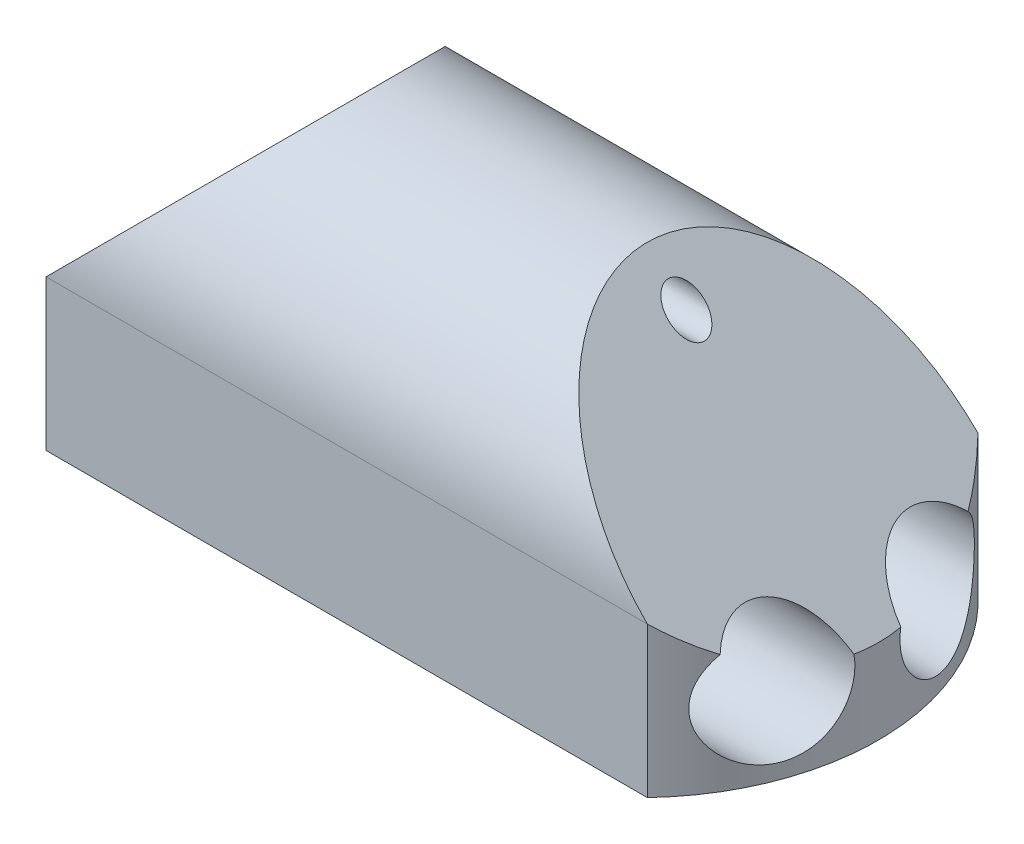
ISO-10303-21;
HEADER;
FILE_DESCRIPTION(('STEP AP214'),'2;1');
FILE_NAME('part.step','',(''),(''),'','','');
FILE_SCHEMA(('AUTOMOTIVE_DESIGN { 1 0 10303 214 1 1 1 1 }'));
ENDSEC;
DATA;
#1=APPLICATION_CONTEXT('core data for automotive mechanical design processes');
#2=APPLICATION_PROTOCOL_DEFINITION('international standard','automotive_design',2000,#1);
#3=PRODUCT_CONTEXT('',#1,'mechanical');
#4=PRODUCT('Part','Part','',(#3));
#5=PRODUCT_RELATED_PRODUCT_CATEGORY('part','',(#4));
#6=PRODUCT_DEFINITION_FORMATION('','',#4);
#7=PRODUCT_DEFINITION_CONTEXT('part definition',#1,'design');
#8=PRODUCT_DEFINITION('design','',#6,#7);
#9=PRODUCT_DEFINITION_SHAPE('','',#8);
#10=(LENGTH_UNIT() NAMED_UNIT(*) SI_UNIT(.MILLI.,.METRE.));
#11=(NAMED_UNIT(*) PLANE_ANGLE_UNIT() SI_UNIT($,.RADIAN.));
#12=(NAMED_UNIT(*) SI_UNIT($,.STERADIAN.) SOLID_ANGLE_UNIT());
#13=UNCERTAINTY_MEASURE_WITH_UNIT(LENGTH_MEASURE(1.E-05),#10,'distance_accuracy_value','');
#14=(GEOMETRIC_REPRESENTATION_CONTEXT(3) GLOBAL_UNCERTAINTY_ASSIGNED_CONTEXT((#13)) GLOBAL_UNIT_ASSIGNED_CONTEXT((#10,
#11,#12)) REPRESENTATION_CONTEXT('',''));
#15=CARTESIAN_POINT('',(0.,0.,0.));
#16=DIRECTION('',(0.,0.,1.));
#17=DIRECTION('',(1.,0.,0.));
#18=AXIS2_PLACEMENT_3D('',#15,#16,#17);
#19=CARTESIAN_POINT('',(0.,0.,0.));
#20=DIRECTION('',(0.,1.,0.));
#21=DIRECTION('',(0.,0.,1.));
#22=AXIS2_PLACEMENT_3D('',#19,#20,#21);
#23=PLANE('',#22);
#24=CARTESIAN_POINT('',(-32.7780332745251,0.,-6.985));
#25=DIRECTION('',(0.,1.,0.));
#26=DIRECTION('',(0.,0.,-1.));
#27=AXIS2_PLACEMENT_3D('',#24,#25,#26);
#28=CIRCLE('',#27,10.16);
#29=CARTESIAN_POINT('',(-25.4,0.,0.));
#30=VERTEX_POINT('',#29);
#31=CARTESIAN_POINT('',(-25.4,0.,-13.97));
#32=VERTEX_POINT('',#31);
#33=EDGE_CURVE('E95',#30,#32,#28,.T.);
#34=ORIENTED_EDGE('',*,*,#33,.T.);
#35=DIRECTION('',(-1.,0.,0.));
#36=VECTOR('',#35,1.);
#37=CARTESIAN_POINT('',(0.,0.,-13.97));
#38=LINE('',#37,#36);
#39=CARTESIAN_POINT('',(0.,0.,-13.97));
#40=VERTEX_POINT('',#39);
#41=EDGE_CURVE('E110',#40,#32,#38,.T.);
#42=ORIENTED_EDGE('',*,*,#41,.F.);
#43=CARTESIAN_POINT('',(-7.37803327452513,0.,-6.985));
#44=DIRECTION('',(0.,1.,0.));
#45=DIRECTION('',(0.,0.,-1.));
#46=AXIS2_PLACEMENT_3D('',#43,#44,#45);
#47=CIRCLE('',#46,10.16);
#48=CARTESIAN_POINT('',(0.,0.,0.));
#49=VERTEX_POINT('',#48);
#50=EDGE_CURVE('E199',#49,#40,#47,.T.);
#51=ORIENTED_EDGE('',*,*,#50,.F.);
#52=DIRECTION('',(1.,0.,0.));
#53=VECTOR('',#52,1.);
#54=CARTESIAN_POINT('',(0.,0.,0.));
#55=LINE('',#54,#53);
#56=EDGE_CURVE('E112',#30,#49,#55,.T.);
#57=ORIENTED_EDGE('',*,*,#56,.F.);
#58=EDGE_LOOP('',(#34,#42,#51,#57));
#59=FACE_BOUND('',#58,.T.);
#60=ADVANCED_FACE('F35',(#59),#23,.F.);
#61=CARTESIAN_POINT('',(-18.4150000000001,13.335,-13.97));
#62=DIRECTION('',(0.707106781186551,-0.707106781186544,0.));
#63=DIRECTION('',(0.707106781186544,0.707106781186551,0.));
#64=AXIS2_PLACEMENT_3D('',#61,#62,#63);
#65=PLANE('',#64);
#66=CARTESIAN_POINT('',(-20.0660000000001,11.684,-6.985));
#67=DIRECTION('',(0.707106781186551,-0.707106781186544,0.));
#68=DIRECTION('',(0.707106781186544,0.707106781186551,0.));
#69=AXIS2_PLACEMENT_3D('',#66,#67,#68);
#70=ELLIPSE('',#69,1.07763073452829,0.761999999999999);
#71=CARTESIAN_POINT('',(-19.3040000000001,12.446,-6.985));
#72=VERTEX_POINT('',#71);
#73=EDGE_CURVE('E116',#72,#72,#70,.T.);
#74=ORIENTED_EDGE('',*,*,#73,.T.);
#75=EDGE_LOOP('',(#74));
#76=FACE_BOUND('',#75,.T.);
#77=CARTESIAN_POINT('',(-32.7780332745251,-1.02803327452521,-6.985));
#78=DIRECTION('',(0.707106781186551,-0.707106781186544,0.));
#79=DIRECTION('',(-0.707106781186544,-0.707106781186551,0.));
#80=AXIS2_PLACEMENT_3D('',#77,#78,#79);
#81=ELLIPSE('',#80,14.3684097937107,10.16);
#82=CARTESIAN_POINT('',(-25.4,6.35,0.));
#83=VERTEX_POINT('',#82);
#84=CARTESIAN_POINT('',(-25.4,6.34999999999999,-13.97));
#85=VERTEX_POINT('',#84);
#86=EDGE_CURVE('E98',#83,#85,#81,.F.);
#87=ORIENTED_EDGE('',*,*,#86,.F.);
#88=CARTESIAN_POINT('',(-25.4,6.35,-6.985));
#89=DIRECTION('',(0.707106781186551,-0.707106781186544,0.));
#90=DIRECTION('',(0.707106781186544,0.707106781186551,0.));
#91=AXIS2_PLACEMENT_3D('',#88,#89,#90);
#92=ELLIPSE('',#91,9.87828173317602,6.985);
#93=EDGE_CURVE('E132',#83,#85,#92,.F.);
#94=ORIENTED_EDGE('',*,*,#93,.T.);
#95=EDGE_LOOP('',(#87,#94));
#96=FACE_BOUND('',#95,.T.);
#97=ADVANCED_FACE('F171',(#76,#96),#65,.F.);
#98=CARTESIAN_POINT('',(-25.4,3.175,-10.4775));
#99=DIRECTION('',(1.,0.,0.));
#100=DIRECTION('',(0.,0.,-1.));
#101=AXIS2_PLACEMENT_3D('',#98,#99,#100);
#102=CYLINDRICAL_SURFACE('',#101,2.54);
#103=CARTESIAN_POINT('',(2.73721974999186,3.175,-7.9375));
#104=CARTESIAN_POINT('',(2.73721906027399,3.31695056010636,-7.93749809184022));
#105=CARTESIAN_POINT('',(2.7361177638684,3.45888281351642,-7.94942622657704));
#106=CARTESIAN_POINT('',(2.73148988664729,3.73870929600429,-7.99678273971192));
#107=CARTESIAN_POINT('',(2.72796384850385,3.87660442141807,-8.03220585972523));
#108=CARTESIAN_POINT('',(2.71785686136224,4.14449569136922,-8.12552153858456));
#109=CARTESIAN_POINT('',(2.71127506852978,4.27448964280844,-8.18342030326473));
#110=CARTESIAN_POINT('',(2.69411872174891,4.52281674788083,-8.31994051210836));
#111=CARTESIAN_POINT('',(2.68354417037861,4.64114990904327,-8.39856194289127));
#112=CARTESIAN_POINT('',(2.65737021025236,4.86233039821777,-8.57373015225616));
#113=CARTESIAN_POINT('',(2.64179023884371,4.96523540687207,-8.67020698910633));
#114=CARTESIAN_POINT('',(2.60458390497793,5.15322646670759,-8.87816783220989));
#115=CARTESIAN_POINT('',(2.58295815684411,5.23831432678884,-8.98965031311366));
#116=CARTESIAN_POINT('',(2.53303875766416,5.38814731172166,-9.22340215352028));
#117=CARTESIAN_POINT('',(2.50477732509994,5.45298730963365,-9.34561766003924));
#118=CARTESIAN_POINT('',(2.44123667040064,5.56157396499359,-9.59735149592417));
#119=CARTESIAN_POINT('',(2.40595716539039,5.60531977196134,-9.7268701195037));
#120=CARTESIAN_POINT('',(2.32790633294339,5.67189306645257,-9.99161075018914));
#121=CARTESIAN_POINT('',(2.28501297540674,5.69433487496833,-10.1268932151274));
#122=CARTESIAN_POINT('',(2.1929246559385,5.71735222611859,-10.3971500560066));
#123=CARTESIAN_POINT('',(2.14372802851654,5.71792197757359,-10.5321243408898));
#124=CARTESIAN_POINT('',(2.03703230003428,5.6975663986833,-10.8066654636064));
#125=CARTESIAN_POINT('',(1.97920925295769,5.67532251127417,-10.9460073162003));
#126=CARTESIAN_POINT('',(1.85957299107775,5.60882845300609,-11.21752662161));
#127=CARTESIAN_POINT('',(1.79775835276084,5.56457039313602,-11.3497014872154));
#128=CARTESIAN_POINT('',(1.66674155569754,5.45079865577947,-11.6154921570743));
#129=CARTESIAN_POINT('',(1.59736588896667,5.37941584672289,-11.7482244113817));
#130=CARTESIAN_POINT('',(1.45944542936374,5.21406415592915,-11.9994942479038));
#131=CARTESIAN_POINT('',(1.39090152890937,5.12007294089013,-12.1180176195701));
#132=CARTESIAN_POINT('',(1.25567521202204,4.90660530194709,-12.3424749303166));
#133=CARTESIAN_POINT('',(1.18918905371905,4.78623088142613,-12.4476794405121));
#134=CARTESIAN_POINT('',(1.06656133771189,4.52440743159231,-12.6353977355142));
#135=CARTESIAN_POINT('',(1.01039967044568,4.38300036232294,-12.717955787851));
#136=CARTESIAN_POINT('',(0.928046966015525,4.12452450197372,-12.8363507331254));
#137=CARTESIAN_POINT('',(0.89786755227368,4.01173926567244,-12.8787971019484));
#138=CARTESIAN_POINT('',(0.848444513409539,3.77909173627619,-12.9475893644231));
#139=CARTESIAN_POINT('',(0.829189476977787,3.65923697287831,-12.9739520608218));
#140=CARTESIAN_POINT('',(0.803390037630915,3.41503168480746,-13.009152467513));
#141=CARTESIAN_POINT('',(0.796903631030834,3.29066324803801,-13.0179102182822));
#142=CARTESIAN_POINT('',(0.797530963032158,3.04201466989851,-13.0170602486967));
#143=CARTESIAN_POINT('',(0.8046448211437,2.91773452931393,-13.007452366957));
#144=CARTESIAN_POINT('',(0.830732572510217,2.68192396582766,-12.9718345496826));
#145=CARTESIAN_POINT('',(0.84884072020756,2.57011028353011,-12.9470207824147));
#146=CARTESIAN_POINT('',(0.894600013099327,2.35263673297545,-12.8833611438528));
#147=CARTESIAN_POINT('',(0.922253752927593,2.24697854700956,-12.8445114572531));
#148=CARTESIAN_POINT('',(0.987695258382301,2.03551147427037,-12.7507344336018));
#149=CARTESIAN_POINT('',(1.02611479936958,1.93036100598287,-12.694772911681));
#150=CARTESIAN_POINT('',(1.10941143668679,1.73067953870902,-12.5702035461584));
#151=CARTESIAN_POINT('',(1.15429189436589,1.63615411336586,-12.501589114515));
#152=CARTESIAN_POINT('',(1.25665128041502,1.44284156374011,-12.3402281284955));
#153=CARTESIAN_POINT('',(1.31495424654182,1.34626001087146,-12.2453598020459));
#154=CARTESIAN_POINT('',(1.43445809697138,1.16998498144274,-12.0426152310849));
#155=CARTESIAN_POINT('',(1.49566102521998,1.09030363975982,-11.934729726452));
#156=CARTESIAN_POINT('',(1.62717029683438,0.938826493308004,-11.6917569750087));
#157=CARTESIAN_POINT('',(1.69753331379615,0.86976418247584,-11.5549832839876));
#158=CARTESIAN_POINT('',(1.83550550464592,0.756942471523878,-11.2700167081104));
#159=CARTESIAN_POINT('',(1.90311404247494,0.713188885205304,-11.121821208343));
#160=CARTESIAN_POINT('',(2.03381445550775,0.652643520262339,-10.8152573893652));
#161=CARTESIAN_POINT('',(2.09682223098564,0.636270921474232,-10.656768832437));
#162=CARTESIAN_POINT('',(2.21475600584456,0.633873764258213,-10.3365724228354));
#163=CARTESIAN_POINT('',(2.26968694974814,0.647830555323477,-10.1748666091462));
#164=CARTESIAN_POINT('',(2.36580205827442,0.704855325686302,-9.86721285573255));
#165=CARTESIAN_POINT('',(2.40773845289998,0.745479263818787,-9.72104764309525));
#166=CARTESIAN_POINT('',(2.48288855469151,0.853175501014853,-9.43642113537756));
#167=CARTESIAN_POINT('',(2.51610642859401,0.920235127510896,-9.29795618523277));
#168=CARTESIAN_POINT('',(2.57185942217286,1.07313128416887,-9.04432875784174));
#169=CARTESIAN_POINT('',(2.59501846064525,1.15713328451185,-8.92819356657036));
#170=CARTESIAN_POINT('',(2.6348725232538,1.34414496075781,-8.7111253783054));
#171=CARTESIAN_POINT('',(2.6515688306576,1.44715085716115,-8.61018936573205));
#172=CARTESIAN_POINT('',(2.67918595743262,1.66626043347009,-8.42934036755286));
#173=CARTESIAN_POINT('',(2.690247091357,1.78194851492975,-8.34894439581169));
#174=CARTESIAN_POINT('',(2.70830903569951,2.02527292658786,-8.20825192444117));
#175=CARTESIAN_POINT('',(2.71530889795265,2.15291203886289,-8.14796011982838));
#176=CARTESIAN_POINT('',(2.72660741929951,2.42662602776476,-8.04552974864473));
#177=CARTESIAN_POINT('',(2.73065900664141,2.57336441692772,-8.0051288630493));
#178=CARTESIAN_POINT('',(2.73596559098812,2.87174204759842,-7.95111452259225));
#179=CARTESIAN_POINT('',(2.73722048668505,3.02338146644012,-7.9375020381208));
#180=CARTESIAN_POINT('',(2.73721974999186,3.175,-7.9375));
#181=B_SPLINE_CURVE_WITH_KNOTS('',3,(#103,#104,#105,#106,#107,#108,#109,#110,#111,#112,#113,
#114,#115,#116,#117,#118,#119,#120,#121,#122,#123,#124,#125,#126,#127,#128,#129,#130,#131,#132,
#133,#134,#135,#136,#137,#138,#139,#140,#141,#142,#143,#144,#145,#146,#147,#148,#149,#150,#151,
#152,#153,#154,#155,#156,#157,#158,#159,#160,#161,#162,#163,#164,#165,#166,#167,#168,#169,#170,
#171,#172,#173,#174,#175,#176,#177,#178,#179,#180),.UNSPECIFIED.,.T.,.F.,(4,2,2,2,2,2,2,2,2,2,2,
2,2,2,2,2,2,2,2,2,2,2,2,2,2,2,2,2,2,2,2,2,2,2,2,2,2,2,4),(0.,0.425318588981189,
0.850542020020345,1.27588294469666,1.70122359473223,2.12493210565385,2.54859757835587,
2.97024706435505,3.39191354908911,3.82107580036381,4.2503516823998,4.705917643569,
5.16164697935762,5.65720360692176,6.15325178610116,6.6699487514686,7.18562840161105,
7.55680538329195,7.92759392628081,8.30006277487051,8.67253489648527,9.01891411829597,
9.3653875653644,9.73945997637023,10.1137277099476,10.5542216683639,10.9950308523272,
11.4985367658284,12.0021582964548,12.5134215503766,13.0243705012261,13.4940227505119,
13.9634501342138,14.3968750719173,14.8302139027,15.2521587637378,15.6742020945561,
16.12847184081,16.5827580423493),.UNSPECIFIED.);
#182=CARTESIAN_POINT('',(1.32848033710142,5.02151966289856,-12.221623027349));
#183=VERTEX_POINT('',#182);
#184=CARTESIAN_POINT('',(2.73350438603333,3.61649561396664,-7.97616403239225));
#185=VERTEX_POINT('',#184);
#186=EDGE_CURVE('E49',#183,#185,#181,.T.);
#187=ORIENTED_EDGE('',*,*,#186,.F.);
#188=CARTESIAN_POINT('',(3.17499999999997,3.175,-10.4775));
#189=DIRECTION('',(-0.707106781186551,-0.707106781186544,0.));
#190=DIRECTION('',(-0.707106781186544,0.707106781186551,0.));
#191=AXIS2_PLACEMENT_3D('',#188,#189,#190);
#192=ELLIPSE('',#191,3.59210244842764,2.54);
#193=EDGE_CURVE('E61',#185,#183,#192,.T.);
#194=ORIENTED_EDGE('',*,*,#193,.F.);
#195=EDGE_LOOP('',(#187,#194));
#196=FACE_BOUND('',#195,.T.);
#197=CARTESIAN_POINT('',(-24.6027935991395,3.175,-13.0175));
#198=CARTESIAN_POINT('',(-24.6027966772723,3.30018653832455,-13.0175030201078));
#199=CARTESIAN_POINT('',(-24.595900607442,3.42535661642611,-13.0081915560159));
#200=CARTESIAN_POINT('',(-24.5690863608112,3.67160149412925,-12.9715923788197));
#201=CARTESIAN_POINT('',(-24.5491626115201,3.79267451792812,-12.9442969731832));
#202=CARTESIAN_POINT('',(-24.4983891994344,4.02673881055394,-12.8735442429834));
#203=CARTESIAN_POINT('',(-24.4675989255979,4.13977007361573,-12.8301747051808));
#204=CARTESIAN_POINT('',(-24.3974995915055,4.35638522763789,-12.7292163983443));
#205=CARTESIAN_POINT('',(-24.3581876792693,4.45996593920316,-12.6716228679925));
#206=CARTESIAN_POINT('',(-24.2694371171888,4.66568853781863,-12.5380527919097));
#207=CARTESIAN_POINT('',(-24.2193927346041,4.7667708455449,-12.4608538726252));
#208=CARTESIAN_POINT('',(-24.1147431082981,4.95509408554005,-12.2937417512434));
#209=CARTESIAN_POINT('',(-24.0601355044007,5.04232778658788,-12.2038219528204));
#210=CARTESIAN_POINT('',(-23.9388217290378,5.2163243400535,-11.9960697280365));
#211=CARTESIAN_POINT('',(-23.8716860599448,5.30026593846721,-11.8761144870311));
#212=CARTESIAN_POINT('',(-23.7375503998917,5.44647153508358,-11.6235072149545));
#213=CARTESIAN_POINT('',(-23.6705505151299,5.50872243387198,-11.4908475728923));
#214=CARTESIAN_POINT('',(-23.5346539370555,5.61352781846064,-11.2054561336206));
#215=CARTESIAN_POINT('',(-23.4659735830159,5.65432090870956,-11.0519662231193));
#216=CARTESIAN_POINT('',(-23.3348618989513,5.70667728528842,-10.7374779802356));
#217=CARTESIAN_POINT('',(-23.2724284004546,5.71825074867378,-10.5764822819863));
#218=CARTESIAN_POINT('',(-23.1591422418123,5.71038637829767,-10.2605501842041));
#219=CARTESIAN_POINT('',(-23.1078568872538,5.69252580716083,-10.1057325919467));
#220=CARTESIAN_POINT('',(-23.0143248199334,5.62781684150893,-9.79946075021638));
#221=CARTESIAN_POINT('',(-22.9720723918642,5.58098684998462,-9.64800442870025));
#222=CARTESIAN_POINT('',(-22.9003960365494,5.46427664532614,-9.36764065410984));
#223=CARTESIAN_POINT('',(-22.870164509262,5.39682206794475,-9.2379264920676));
#224=CARTESIAN_POINT('',(-22.8172293018164,5.23976025939415,-8.9909752041241));
#225=CARTESIAN_POINT('',(-22.7945236195898,5.15015893092111,-8.87373476553573));
#226=CARTESIAN_POINT('',(-22.7566974939606,4.95609336683187,-8.66117513604803));
#227=CARTESIAN_POINT('',(-22.7412678009352,4.85253805967186,-8.56507885118109));
#228=CARTESIAN_POINT('',(-22.715423928938,4.63054157361901,-8.39114483451089));
#229=CARTESIAN_POINT('',(-22.7050095056098,4.51210112032186,-8.31330621324403));
#230=CARTESIAN_POINT('',(-22.6881668833979,4.26434392655092,-8.1786494347927));
#231=CARTESIAN_POINT('',(-22.6817190002024,4.13508457062314,-8.1217280506002));
#232=CARTESIAN_POINT('',(-22.6718163639892,3.8688232576085,-8.03004502411427));
#233=CARTESIAN_POINT('',(-22.6683617020157,3.73182106514443,-7.99528405587801));
#234=CARTESIAN_POINT('',(-22.6638216177866,3.45302526869234,-7.94878465300329));
#235=CARTESIAN_POINT('',(-22.6627514485585,3.3112066763051,-7.93719448456014));
#236=CARTESIAN_POINT('',(-22.6628102079115,3.02761995838669,-7.937817803255));
#237=CARTESIAN_POINT('',(-22.6639391913154,2.88585183420175,-7.95003188381141));
#238=CARTESIAN_POINT('',(-22.6686289005705,2.60600059542763,-7.99797471874004));
#239=CARTESIAN_POINT('',(-22.6721960518284,2.46792822196339,-8.03376559698812));
#240=CARTESIAN_POINT('',(-22.6824065684849,2.19980167345853,-8.12786739272736));
#241=CARTESIAN_POINT('',(-22.689049902893,2.06974741765534,-8.1861780833445));
#242=CARTESIAN_POINT('',(-22.7063375871229,1.8216839706007,-8.32339274744581));
#243=CARTESIAN_POINT('',(-22.7169725634684,1.70364737771994,-8.40224834416381));
#244=CARTESIAN_POINT('',(-22.7433252401187,1.48266556997117,-8.57814674015882));
#245=CARTESIAN_POINT('',(-22.7590424886944,1.37971901503184,-8.6751879227183));
#246=CARTESIAN_POINT('',(-22.7964555484149,1.19239909324887,-8.88363639854859));
#247=CARTESIAN_POINT('',(-22.8181119987727,1.10790980721655,-8.99494662639658));
#248=CARTESIAN_POINT('',(-22.8681719493131,0.958807206228872,-9.22877402911151));
#249=CARTESIAN_POINT('',(-22.8965750958988,0.894192850027464,-9.3512906164417));
#250=CARTESIAN_POINT('',(-22.9605174487768,0.785963198910119,-9.60396998269557));
#251=CARTESIAN_POINT('',(-22.9960783222532,0.742413063624974,-9.73415510763248));
#252=CARTESIAN_POINT('',(-23.074053668157,0.676999300529446,-9.99785447069326));
#253=CARTESIAN_POINT('',(-23.1164692506968,0.655139189495106,-10.1313692450833));
#254=CARTESIAN_POINT('',(-23.2092032441223,0.632280748698048,-10.4032612843401));
#255=CARTESIAN_POINT('',(-23.2597650656615,0.632127875950935,-10.5416254546965));
#256=CARTESIAN_POINT('',(-23.3662335790107,0.653734088478592,-10.8145054102903));
#257=CARTESIAN_POINT('',(-23.4221418405564,0.675499627071429,-10.9490200501362));
#258=CARTESIAN_POINT('',(-23.5423153611568,0.742145033586789,-11.2218696058777));
#259=CARTESIAN_POINT('',(-23.6068913813567,0.788734272845651,-11.3596496788879));
#260=CARTESIAN_POINT('',(-23.7380387515858,0.904174598796409,-11.6246118270681));
#261=CARTESIAN_POINT('',(-23.8046116304094,0.973043158733937,-11.751785485037));
#262=CARTESIAN_POINT('',(-23.9420575341042,1.13764379685554,-12.0022767886119));
#263=CARTESIAN_POINT('',(-24.0128669342844,1.23503611345806,-12.1245434088621));
#264=CARTESIAN_POINT('',(-24.1493879606964,1.45230115504296,-12.3505846801099));
#265=CARTESIAN_POINT('',(-24.2151031008353,1.57215818576942,-12.454372142868));
#266=CARTESIAN_POINT('',(-24.3241835860862,1.80649195206969,-12.6211252962483));
#267=CARTESIAN_POINT('',(-24.3693908001693,1.9172560504611,-12.6881039319954));
#268=CARTESIAN_POINT('',(-24.4501445825427,2.15053709429673,-12.8053905256951));
#269=CARTESIAN_POINT('',(-24.4857004028499,2.2730426306055,-12.8557144593948));
#270=CARTESIAN_POINT('',(-24.5430382321084,2.52329069369004,-12.9358688692223));
#271=CARTESIAN_POINT('',(-24.5652168481099,2.65074892697718,-12.966291969961));
#272=CARTESIAN_POINT('',(-24.5950873450962,2.91048008082097,-13.0070982478488));
#273=CARTESIAN_POINT('',(-24.6027903473086,3.04274922557429,-13.0174968094685));
#274=CARTESIAN_POINT('',(-24.6027935991395,3.175,-13.0175));
#275=B_SPLINE_CURVE_WITH_KNOTS('',3,(#197,#198,#199,#200,#201,#202,#203,#204,#205,#206,#207,
#208,#209,#210,#211,#212,#213,#214,#215,#216,#217,#218,#219,#220,#221,#222,#223,#224,#225,#226,
#227,#228,#229,#230,#231,#232,#233,#234,#235,#236,#237,#238,#239,#240,#241,#242,#243,#244,#245,
#246,#247,#248,#249,#250,#251,#252,#253,#254,#255,#256,#257,#258,#259,#260,#261,#262,#263,#264,
#265,#266,#267,#268,#269,#270,#271,#272,#273,#274),.UNSPECIFIED.,.T.,.F.,(4,2,2,2,2,2,2,2,2,2,2,
2,2,2,2,2,2,2,2,2,2,2,2,2,2,2,2,2,2,2,2,2,2,2,2,2,2,2,4),(0.,0.37502119018989,0.750202897868295,
1.12336508858388,1.49665236075328,1.90519056026372,2.31394138632751,2.7951058664277,
3.27656042904469,3.79302431260913,4.30930828945736,4.79881530067425,5.28801166862788,
5.73361929078032,6.17910827451592,6.60342171805122,7.02771448589668,7.44988430892716,
7.87206697255697,8.29694257698478,8.72182877331251,9.1478390294207,9.57384499383516,
9.99885677480127,10.4238307896863,10.8460537413329,11.2682545689824,11.691753201418,
12.1153204878381,12.5553805880568,12.9955702906579,13.4709645065695,13.9467324726674,
14.4591365974195,14.9711840727398,15.3808892682627,15.7902003140137,16.1866885654344,
16.5828720807903),.UNSPECIFIED.);
#276=CARTESIAN_POINT('',(-24.6027935991395,3.175,-13.0175));
#277=VERTEX_POINT('',#276);
#278=EDGE_CURVE('E158',#277,#277,#275,.T.);
#279=ORIENTED_EDGE('',*,*,#278,.F.);
#280=EDGE_LOOP('',(#279));
#281=FACE_BOUND('',#280,.T.);
#282=ADVANCED_FACE('F166',(#196,#281),#102,.F.);
#283=CARTESIAN_POINT('',(-25.4,3.175,-3.4925));
#284=DIRECTION('',(1.,0.,0.));
#285=DIRECTION('',(0.,0.,-1.));
#286=AXIS2_PLACEMENT_3D('',#283,#284,#285);
#287=CYLINDRICAL_SURFACE('',#286,2.54);
#288=CARTESIAN_POINT('',(0.797206400860541,3.175,-0.9525));
#289=CARTESIAN_POINT('',(0.797203322727675,3.30018653832455,-0.952496979892189));
#290=CARTESIAN_POINT('',(0.804099392558012,3.42535661642611,-0.961808443984064));
#291=CARTESIAN_POINT('',(0.830913639188777,3.67160149412925,-0.998407621180264));
#292=CARTESIAN_POINT('',(0.850837388479949,3.79267451792812,-1.02570302681684));
#293=CARTESIAN_POINT('',(0.901610800565639,4.02673881055394,-1.09645575701659));
#294=CARTESIAN_POINT('',(0.932401074402147,4.13977007361573,-1.13982529481918));
#295=CARTESIAN_POINT('',(1.00250040849447,4.35638522763789,-1.24078360165574));
#296=CARTESIAN_POINT('',(1.04181232073071,4.45996593920316,-1.29837713200753));
#297=CARTESIAN_POINT('',(1.13056288281124,4.66568853781863,-1.43194720809033));
#298=CARTESIAN_POINT('',(1.18060726539591,4.7667708455449,-1.50914612737485));
#299=CARTESIAN_POINT('',(1.28525689170187,4.95509408554005,-1.67625824875661));
#300=CARTESIAN_POINT('',(1.33986449559934,5.04232778658789,-1.76617804717964));
#301=CARTESIAN_POINT('',(1.46117827096218,5.2163243400535,-1.97393027196351));
#302=CARTESIAN_POINT('',(1.52831394005521,5.30026593846721,-2.09388551296892));
#303=CARTESIAN_POINT('',(1.66244960010827,5.44647153508358,-2.34649278504546));
#304=CARTESIAN_POINT('',(1.72944948487012,5.50872243387198,-2.47915242710772));
#305=CARTESIAN_POINT('',(1.86534606294454,5.61352781846064,-2.76454386637938));
#306=CARTESIAN_POINT('',(1.93402641698407,5.65432090870956,-2.91803377688069));
#307=CARTESIAN_POINT('',(2.06513810104875,5.70667728528842,-3.23252201976444));
#308=CARTESIAN_POINT('',(2.12757159954547,5.71825074867378,-3.39351771801375));
#309=CARTESIAN_POINT('',(2.24085775818774,5.71038637829767,-3.70944981579589));
#310=CARTESIAN_POINT('',(2.29214311274623,5.69252580716083,-3.86426740805335));
#311=CARTESIAN_POINT('',(2.38567518006661,5.62781684150893,-4.17053924978363));
#312=CARTESIAN_POINT('',(2.42792760813586,5.58098684998462,-4.32199557129976));
#313=CARTESIAN_POINT('',(2.49960396345063,5.46427664532614,-4.60235934589017));
#314=CARTESIAN_POINT('',(2.52983549073803,5.39682206794475,-4.73207350793241));
#315=CARTESIAN_POINT('',(2.5827706981836,5.23976025939415,-4.9790247958759));
#316=CARTESIAN_POINT('',(2.60547638041024,5.15015893092111,-5.09626523446428));
#317=CARTESIAN_POINT('',(2.64330250603939,4.95609336683187,-5.30882486395198));
#318=CARTESIAN_POINT('',(2.6587321990648,4.85253805967186,-5.40492114881892));
#319=CARTESIAN_POINT('',(2.68457607106205,4.63054157361902,-5.57885516548912));
#320=CARTESIAN_POINT('',(2.6949904943902,4.51210112032186,-5.65669378675598));
#321=CARTESIAN_POINT('',(2.71183311660211,4.26434392655092,-5.79135056520731));
#322=CARTESIAN_POINT('',(2.71828099979761,4.13508457062314,-5.84827194939981));
#323=CARTESIAN_POINT('',(2.72818363601078,3.8688232576085,-5.93995497588574));
#324=CARTESIAN_POINT('',(2.73163829798427,3.73182106514443,-5.974715944122));
#325=CARTESIAN_POINT('',(2.73617838221343,3.45302526869234,-6.02121534699671));
#326=CARTESIAN_POINT('',(2.73724855144149,3.3112066763051,-6.03280551543987));
#327=CARTESIAN_POINT('',(2.73718979208853,3.02761995838669,-6.032182196745));
#328=CARTESIAN_POINT('',(2.73606080868463,2.88585183420175,-6.01996811618859));
#329=CARTESIAN_POINT('',(2.73137109942947,2.60600059542763,-5.97202528125997));
#330=CARTESIAN_POINT('',(2.72780394817164,2.46792822196339,-5.93623440301189));
#331=CARTESIAN_POINT('',(2.71759343151512,2.19980167345853,-5.84213260727265));
#332=CARTESIAN_POINT('',(2.71095009710704,2.06974741765534,-5.78382191665551));
#333=CARTESIAN_POINT('',(2.69366241287708,1.8216839706007,-5.64660725255419));
#334=CARTESIAN_POINT('',(2.68302743653165,1.70364737771994,-5.56775165583619));
#335=CARTESIAN_POINT('',(2.65667475988127,1.48266556997117,-5.39185325984119));
#336=CARTESIAN_POINT('',(2.64095751130558,1.37971901503184,-5.2948120772817));
#337=CARTESIAN_POINT('',(2.60354445158511,1.19239909324887,-5.08636360145142));
#338=CARTESIAN_POINT('',(2.58188800122736,1.10790980721655,-4.97505337360343));
#339=CARTESIAN_POINT('',(2.53182805068687,0.958807206228872,-4.7412259708885));
#340=CARTESIAN_POINT('',(2.50342490410125,0.894192850027463,-4.6187093835583));
#341=CARTESIAN_POINT('',(2.43948255122319,0.785963198910118,-4.36603001730444));
#342=CARTESIAN_POINT('',(2.40392167774679,0.742413063624973,-4.23584489236753));
#343=CARTESIAN_POINT('',(2.325946331843,0.676999300529445,-3.97214552930674));
#344=CARTESIAN_POINT('',(2.28353074930317,0.655139189495105,-3.83863075491673));
#345=CARTESIAN_POINT('',(2.19079675587769,0.632280748698047,-3.56673871565987));
#346=CARTESIAN_POINT('',(2.14023493433853,0.632127875950934,-3.42837454530352));
#347=CARTESIAN_POINT('',(2.03376642098927,0.653734088478591,-3.15549458970967));
#348=CARTESIAN_POINT('',(1.97785815944357,0.675499627071428,-3.02097994986377));
#349=CARTESIAN_POINT('',(1.85768463884323,0.742145033586787,-2.74813039412227));
#350=CARTESIAN_POINT('',(1.79310861864335,0.788734272845649,-2.61035032111214));
#351=CARTESIAN_POINT('',(1.66196124841421,0.904174598796408,-2.34538817293188));
#352=CARTESIAN_POINT('',(1.59538836959064,0.973043158733936,-2.21821451496298));
#353=CARTESIAN_POINT('',(1.45794246589582,1.13764379685554,-1.96772321138815));
#354=CARTESIAN_POINT('',(1.38713306571564,1.23503611345805,-1.84545659113795));
#355=CARTESIAN_POINT('',(1.25061203930364,1.45230115504296,-1.61941531989013));
#356=CARTESIAN_POINT('',(1.18489689916468,1.57215818576942,-1.51562785713196));
#357=CARTESIAN_POINT('',(1.07581641391381,1.80649195206968,-1.34887470375167));
#358=CARTESIAN_POINT('',(1.03060919983067,1.9172560504611,-1.28189606800462));
#359=CARTESIAN_POINT('',(0.949855417457354,2.15053709429672,-1.16460947430489));
#360=CARTESIAN_POINT('',(0.914299597150164,2.2730426306055,-1.11428554060518));
#361=CARTESIAN_POINT('',(0.856961767891578,2.52329069369004,-1.03413113077774));
#362=CARTESIAN_POINT('',(0.834783151890134,2.65074892697718,-1.00370803003896));
#363=CARTESIAN_POINT('',(0.804912654903794,2.91048008082097,-0.962901752151163));
#364=CARTESIAN_POINT('',(0.797209652691454,3.04274922557429,-0.952503190531523));
#365=CARTESIAN_POINT('',(0.797206400860541,3.175,-0.9525));
#366=B_SPLINE_CURVE_WITH_KNOTS('',3,(#288,#289,#290,#291,#292,#293,#294,#295,#296,#297,#298,
#299,#300,#301,#302,#303,#304,#305,#306,#307,#308,#309,#310,#311,#312,#313,#314,#315,#316,#317,
#318,#319,#320,#321,#322,#323,#324,#325,#326,#327,#328,#329,#330,#331,#332,#333,#334,#335,#336,
#337,#338,#339,#340,#341,#342,#343,#344,#345,#346,#347,#348,#349,#350,#351,#352,#353,#354,#355,
#356,#357,#358,#359,#360,#361,#362,#363,#364,#365),.UNSPECIFIED.,.T.,.F.,(4,2,2,2,2,2,2,2,2,2,2,
2,2,2,2,2,2,2,2,2,2,2,2,2,2,2,2,2,2,2,2,2,2,2,2,2,2,2,4),(0.,0.37502119018989,0.750202897868296,
1.12336508858388,1.49665236075328,1.90519056026372,2.31394138632751,2.79510586642771,
3.27656042904469,3.79302431260913,4.30930828945736,4.79881530067426,5.28801166862789,
5.73361929078033,6.17910827451593,6.60342171805122,7.02771448589668,7.44988430892716,
7.87206697255697,8.29694257698479,8.72182877331251,9.14783902942071,9.57384499383516,
9.99885677480127,10.4238307896863,10.8460537413329,11.2682545689824,11.691753201418,
12.1153204878381,12.5553805880568,12.9955702906579,13.4709645065695,13.9467324726674,
14.4591365974195,14.9711840727398,15.3808892682627,15.7902003140137,16.1866885654344,
16.5828720807903),.UNSPECIFIED.);
#367=CARTESIAN_POINT('',(2.73350438603333,3.61649561396664,-5.99383596760776));
#368=VERTEX_POINT('',#367);
#369=CARTESIAN_POINT('',(1.32848033710142,5.02151966289856,-1.74837697265102));
#370=VERTEX_POINT('',#369);
#371=EDGE_CURVE('E11',#368,#370,#366,.T.);
#372=ORIENTED_EDGE('',*,*,#371,.F.);
#373=CARTESIAN_POINT('',(3.17499999999997,3.175,-3.4925));
#374=DIRECTION('',(-0.707106781186551,-0.707106781186544,0.));
#375=DIRECTION('',(-0.707106781186544,0.707106781186551,0.));
#376=AXIS2_PLACEMENT_3D('',#373,#374,#375);
#377=ELLIPSE('',#376,3.59210244842764,2.54);
#378=EDGE_CURVE('E55',#370,#368,#377,.T.);
#379=ORIENTED_EDGE('',*,*,#378,.F.);
#380=EDGE_LOOP('',(#372,#379));
#381=FACE_BOUND('',#380,.T.);
#382=CARTESIAN_POINT('',(-22.6627802500082,3.175,-6.0325));
#383=CARTESIAN_POINT('',(-22.662780939726,3.31695056010636,-6.03250190815979));
#384=CARTESIAN_POINT('',(-22.6638822361316,3.45888281351642,-6.02057377342297));
#385=CARTESIAN_POINT('',(-22.6685101133527,3.73870929600429,-5.97321726028809));
#386=CARTESIAN_POINT('',(-22.6720361514962,3.87660442141807,-5.93779414027477));
#387=CARTESIAN_POINT('',(-22.6821431386378,4.14449569136922,-5.84447846141545));
#388=CARTESIAN_POINT('',(-22.6887249314702,4.27448964280844,-5.78657969673528));
#389=CARTESIAN_POINT('',(-22.7058812782511,4.52281674788083,-5.65005948789165));
#390=CARTESIAN_POINT('',(-22.7164558296214,4.64114990904327,-5.57143805710874));
#391=CARTESIAN_POINT('',(-22.7426297897477,4.86233039821777,-5.39626984774385));
#392=CARTESIAN_POINT('',(-22.7582097611563,4.96523540687207,-5.29979301089368));
#393=CARTESIAN_POINT('',(-22.7954160950221,5.15322646670759,-5.09183216779012));
#394=CARTESIAN_POINT('',(-22.8170418431559,5.23831432678884,-4.98034968688634));
#395=CARTESIAN_POINT('',(-22.8669612423358,5.38814731172166,-4.74659784647973));
#396=CARTESIAN_POINT('',(-22.8952226749001,5.45298730963365,-4.62438233996076));
#397=CARTESIAN_POINT('',(-22.9587633295994,5.5615739649936,-4.37264850407583));
#398=CARTESIAN_POINT('',(-22.9940428346096,5.60531977196135,-4.24312988049631));
#399=CARTESIAN_POINT('',(-23.0720936670566,5.67189306645257,-3.97838924981087));
#400=CARTESIAN_POINT('',(-23.1149870245933,5.69433487496833,-3.84310678487265));
#401=CARTESIAN_POINT('',(-23.2070753440615,5.7173522261186,-3.57284994399343));
#402=CARTESIAN_POINT('',(-23.2562719714835,5.71792197757359,-3.43787565911018));
#403=CARTESIAN_POINT('',(-23.3629676999657,5.6975663986833,-3.16333453639359));
#404=CARTESIAN_POINT('',(-23.4207907470423,5.67532251127417,-3.02399268379969));
#405=CARTESIAN_POINT('',(-23.5404270089223,5.60882845300609,-2.75247337838998));
#406=CARTESIAN_POINT('',(-23.6022416472392,5.56457039313603,-2.62029851278464));
#407=CARTESIAN_POINT('',(-23.7332584443025,5.45079865577947,-2.35450784292575));
#408=CARTESIAN_POINT('',(-23.8026341110333,5.3794158467229,-2.22177558861829));
#409=CARTESIAN_POINT('',(-23.9405545706363,5.21406415592916,-1.97050575209617));
#410=CARTESIAN_POINT('',(-24.0090984710906,5.12007294089013,-1.85198238042993));
#411=CARTESIAN_POINT('',(-24.144324787978,4.90660530194709,-1.62752506968342));
#412=CARTESIAN_POINT('',(-24.210810946281,4.78623088142613,-1.52232055948787));
#413=CARTESIAN_POINT('',(-24.3334386622881,4.52440743159231,-1.33460226448583));
#414=CARTESIAN_POINT('',(-24.3896003295543,4.38300036232295,-1.25204421214903));
#415=CARTESIAN_POINT('',(-24.4719530339845,4.12452450197372,-1.1336492668746));
#416=CARTESIAN_POINT('',(-24.5021324477263,4.01173926567244,-1.09120289805159));
#417=CARTESIAN_POINT('',(-24.5515554865905,3.77909173627619,-1.02241063557691));
#418=CARTESIAN_POINT('',(-24.5708105230222,3.65923697287831,-0.996047939178183));
#419=CARTESIAN_POINT('',(-24.5966099623691,3.41503168480746,-0.960847532486965));
#420=CARTESIAN_POINT('',(-24.6030963689692,3.29066324803801,-0.952089781717797));
#421=CARTESIAN_POINT('',(-24.6024690369679,3.04201466989851,-0.952939751303317));
#422=CARTESIAN_POINT('',(-24.5953551788563,2.91773452931393,-0.962547633043042));
#423=CARTESIAN_POINT('',(-24.5692674274898,2.68192396582766,-0.998165450317393));
#424=CARTESIAN_POINT('',(-24.5511592797925,2.57011028353011,-1.02297921758527));
#425=CARTESIAN_POINT('',(-24.5053999869007,2.35263673297545,-1.0866388561472));
#426=CARTESIAN_POINT('',(-24.4777462470724,2.24697854700956,-1.12548854274688));
#427=CARTESIAN_POINT('',(-24.4123047416177,2.03551147427038,-1.21926556639819));
#428=CARTESIAN_POINT('',(-24.3738852006304,1.93036100598287,-1.27522708831903));
#429=CARTESIAN_POINT('',(-24.2905885633132,1.73067953870902,-1.39979645384157));
#430=CARTESIAN_POINT('',(-24.2457081056341,1.63615411336586,-1.46841088548504));
#431=CARTESIAN_POINT('',(-24.143348719585,1.44284156374011,-1.62977187150449));
#432=CARTESIAN_POINT('',(-24.0850457534582,1.34626001087146,-1.72464019795408));
#433=CARTESIAN_POINT('',(-23.9655419030286,1.16998498144274,-1.92738476891507));
#434=CARTESIAN_POINT('',(-23.90433897478,1.09030363975982,-2.03527027354798));
#435=CARTESIAN_POINT('',(-23.7728297031656,0.938826493308004,-2.27824302499133));
#436=CARTESIAN_POINT('',(-23.7024666862039,0.86976418247584,-2.41501671601239));
#437=CARTESIAN_POINT('',(-23.5644944953541,0.756942471523878,-2.69998329188965));
#438=CARTESIAN_POINT('',(-23.4968859575251,0.713188885205303,-2.84817879165699));
#439=CARTESIAN_POINT('',(-23.3661855444923,0.652643520262338,-3.15474261063481));
#440=CARTESIAN_POINT('',(-23.3031777690144,0.636270921474231,-3.31323116756299));
#441=CARTESIAN_POINT('',(-23.1852439941554,0.633873764258211,-3.63342757716465));
#442=CARTESIAN_POINT('',(-23.1303130502519,0.647830555323475,-3.79513339085384));
#443=CARTESIAN_POINT('',(-23.0341979417256,0.7048553256863,-4.10278714426746));
#444=CARTESIAN_POINT('',(-22.9922615471,0.745479263818785,-4.24895235690475));
#445=CARTESIAN_POINT('',(-22.9171114453085,0.85317550101485,-4.53357886462244));
#446=CARTESIAN_POINT('',(-22.883893571406,0.920235127510893,-4.67204381476724));
#447=CARTESIAN_POINT('',(-22.8281405778272,1.07313128416887,-4.92567124215826));
#448=CARTESIAN_POINT('',(-22.8049815393548,1.15713328451185,-5.04180643342964));
#449=CARTESIAN_POINT('',(-22.7651274767462,1.34414496075781,-5.25887462169461));
#450=CARTESIAN_POINT('',(-22.7484311693424,1.44715085716114,-5.35981063426796));
#451=CARTESIAN_POINT('',(-22.7208140425674,1.66626043347009,-5.54065963244715));
#452=CARTESIAN_POINT('',(-22.709752908643,1.78194851492975,-5.62105560418832));
#453=CARTESIAN_POINT('',(-22.6916909643005,2.02527292658786,-5.76174807555884));
#454=CARTESIAN_POINT('',(-22.6846911020474,2.15291203886289,-5.82203988017162));
#455=CARTESIAN_POINT('',(-22.6733925807005,2.42662602776476,-5.92447025135528));
#456=CARTESIAN_POINT('',(-22.6693409933586,2.57336441692772,-5.9648711369507));
#457=CARTESIAN_POINT('',(-22.6640344090119,2.87174204759842,-6.01888547740775));
#458=CARTESIAN_POINT('',(-22.662779513315,3.02338146644012,-6.0324979618792));
#459=CARTESIAN_POINT('',(-22.6627802500082,3.175,-6.0325));
#460=B_SPLINE_CURVE_WITH_KNOTS('',3,(#382,#383,#384,#385,#386,#387,#388,#389,#390,#391,#392,
#393,#394,#395,#396,#397,#398,#399,#400,#401,#402,#403,#404,#405,#406,#407,#408,#409,#410,#411,
#412,#413,#414,#415,#416,#417,#418,#419,#420,#421,#422,#423,#424,#425,#426,#427,#428,#429,#430,
#431,#432,#433,#434,#435,#436,#437,#438,#439,#440,#441,#442,#443,#444,#445,#446,#447,#448,#449,
#450,#451,#452,#453,#454,#455,#456,#457,#458,#459),.UNSPECIFIED.,.T.,.F.,(4,2,2,2,2,2,2,2,2,2,2,
2,2,2,2,2,2,2,2,2,2,2,2,2,2,2,2,2,2,2,2,2,2,2,2,2,2,2,4),(0.,0.425318588981189,
0.850542020020345,1.27588294469666,1.70122359473223,2.12493210565385,2.54859757835587,
2.97024706435506,3.39191354908912,3.82107580036381,4.2503516823998,4.705917643569,
5.16164697935762,5.65720360692176,6.15325178610116,6.6699487514686,7.18562840161105,
7.55680538329195,7.92759392628081,8.30006277487052,8.67253489648528,9.01891411829597,
9.3653875653644,9.73945997637023,10.1137277099476,10.5542216683639,10.9950308523272,
11.4985367658284,12.0021582964548,12.5134215503766,13.0243705012261,13.4940227505119,
13.9634501342138,14.3968750719173,14.8302139027,15.2521587637378,15.6742020945561,
16.12847184081,16.5827580423493),.UNSPECIFIED.);
#461=CARTESIAN_POINT('',(-22.6627802500082,3.175,-6.0325));
#462=VERTEX_POINT('',#461);
#463=EDGE_CURVE('E39',#462,#462,#460,.T.);
#464=ORIENTED_EDGE('',*,*,#463,.F.);
#465=EDGE_LOOP('',(#464));
#466=FACE_BOUND('',#465,.T.);
#467=ADVANCED_FACE('F170',(#381,#466),#287,.F.);
#468=CARTESIAN_POINT('',(0.,6.35,-13.97));
#469=DIRECTION('',(0.,0.,1.));
#470=DIRECTION('',(1.,0.,0.));
#471=AXIS2_PLACEMENT_3D('',#468,#469,#470);
#472=PLANE('',#471);
#473=ORIENTED_EDGE('',*,*,#41,.T.);
#474=DIRECTION('',(0.,-1.,0.));
#475=VECTOR('',#474,1.);
#476=CARTESIAN_POINT('',(-25.4,6.35,-13.97));
#477=LINE('',#476,#475);
#478=EDGE_CURVE('E92',#85,#32,#477,.T.);
#479=ORIENTED_EDGE('',*,*,#478,.F.);
#480=DIRECTION('',(-1.,0.,0.));
#481=VECTOR('',#480,1.);
#482=CARTESIAN_POINT('',(0.,6.35,-13.97));
#483=LINE('',#482,#481);
#484=CARTESIAN_POINT('',(0.,6.35,-13.97));
#485=VERTEX_POINT('',#484);
#486=EDGE_CURVE('E118',#485,#85,#483,.T.);
#487=ORIENTED_EDGE('',*,*,#486,.F.);
#488=DIRECTION('',(0.,-1.,0.));
#489=VECTOR('',#488,1.);
#490=CARTESIAN_POINT('',(0.,6.35,-13.97));
#491=LINE('',#490,#489);
#492=EDGE_CURVE('E104',#485,#40,#491,.T.);
#493=ORIENTED_EDGE('',*,*,#492,.T.);
#494=EDGE_LOOP('',(#473,#479,#487,#493));
#495=FACE_BOUND('',#494,.T.);
#496=ADVANCED_FACE('F37',(#495),#472,.F.);
#497=CARTESIAN_POINT('',(0.,6.35,0.));
#498=DIRECTION('',(0.,0.,-1.));
#499=DIRECTION('',(-1.,0.,0.));
#500=AXIS2_PLACEMENT_3D('',#497,#498,#499);
#501=PLANE('',#500);
#502=ORIENTED_EDGE('',*,*,#56,.T.);
#503=DIRECTION('',(0.,-1.,0.));
#504=VECTOR('',#503,1.);
#505=CARTESIAN_POINT('',(0.,6.35,0.));
#506=LINE('',#505,#504);
#507=CARTESIAN_POINT('',(0.,6.35,0.));
#508=VERTEX_POINT('',#507);
#509=EDGE_CURVE('E127',#508,#49,#506,.T.);
#510=ORIENTED_EDGE('',*,*,#509,.F.);
#511=DIRECTION('',(1.,0.,0.));
#512=VECTOR('',#511,1.);
#513=CARTESIAN_POINT('',(0.,6.35,0.));
#514=LINE('',#513,#512);
#515=EDGE_CURVE('E124',#83,#508,#514,.T.);
#516=ORIENTED_EDGE('',*,*,#515,.F.);
#517=DIRECTION('',(0.,-1.,0.));
#518=VECTOR('',#517,1.);
#519=CARTESIAN_POINT('',(-25.4,6.35,0.));
#520=LINE('',#519,#518);
#521=EDGE_CURVE('E105',#83,#30,#520,.T.);
#522=ORIENTED_EDGE('',*,*,#521,.T.);
#523=EDGE_LOOP('',(#502,#510,#516,#522));
#524=FACE_BOUND('',#523,.T.);
#525=ADVANCED_FACE('F187',(#524),#501,.F.);
#526=CARTESIAN_POINT('',(-41.018934822836,6.35,-6.985));
#527=DIRECTION('',(1.,0.,0.));
#528=DIRECTION('',(0.,0.,-1.));
#529=AXIS2_PLACEMENT_3D('',#526,#527,#528);
#530=CYLINDRICAL_SURFACE('',#529,6.985);
#531=CARTESIAN_POINT('',(0.,6.35,-6.985));
#532=DIRECTION('',(-0.707106781186551,-0.707106781186544,0.));
#533=DIRECTION('',(0.707106781186544,-0.707106781186551,0.));
#534=AXIS2_PLACEMENT_3D('',#531,#532,#533);
#535=ELLIPSE('',#534,9.87828173317602,6.985);
#536=EDGE_CURVE('E134',#485,#508,#535,.F.);
#537=ORIENTED_EDGE('',*,*,#536,.F.);
#538=ORIENTED_EDGE('',*,*,#486,.T.);
#539=ORIENTED_EDGE('',*,*,#93,.F.);
#540=ORIENTED_EDGE('',*,*,#515,.T.);
#541=EDGE_LOOP('',(#537,#538,#539,#540));
#542=FACE_BOUND('',#541,.T.);
#543=ADVANCED_FACE('F180',(#542),#530,.T.);
#544=CARTESIAN_POINT('',(-6.98499999999993,13.335,-13.97));
#545=DIRECTION('',(-0.707106781186551,-0.707106781186544,0.));
#546=DIRECTION('',(0.707106781186544,-0.707106781186551,0.));
#547=AXIS2_PLACEMENT_3D('',#544,#545,#546);
#548=PLANE('',#547);
#549=CARTESIAN_POINT('',(-5.33399999999994,11.684,-6.985));
#550=DIRECTION('',(-0.707106781186551,-0.707106781186544,0.));
#551=DIRECTION('',(0.707106781186544,-0.707106781186551,0.));
#552=AXIS2_PLACEMENT_3D('',#549,#550,#551);
#553=ELLIPSE('',#552,1.07763073452829,0.761999999999999);
#554=CARTESIAN_POINT('',(-4.57199999999995,10.922,-6.985));
#555=VERTEX_POINT('',#554);
#556=EDGE_CURVE('E121',#555,#555,#553,.T.);
#557=ORIENTED_EDGE('',*,*,#556,.T.);
#558=EDGE_LOOP('',(#557));
#559=FACE_BOUND('',#558,.T.);
#560=CARTESIAN_POINT('',(-7.37803327452513,13.7280332745252,-6.985));
#561=DIRECTION('',(-0.707106781186551,-0.707106781186544,0.));
#562=DIRECTION('',(0.707106781186544,-0.707106781186551,0.));
#563=AXIS2_PLACEMENT_3D('',#560,#561,#562);
#564=ELLIPSE('',#563,14.3684097937107,10.16);
#565=EDGE_CURVE('E201',#370,#508,#564,.T.);
#566=ORIENTED_EDGE('',*,*,#565,.F.);
#567=ORIENTED_EDGE('',*,*,#378,.T.);
#568=EDGE_CURVE('E204',#185,#368,#564,.T.);
#569=ORIENTED_EDGE('',*,*,#568,.F.);
#570=ORIENTED_EDGE('',*,*,#193,.T.);
#571=EDGE_CURVE('E139',#485,#183,#564,.T.);
#572=ORIENTED_EDGE('',*,*,#571,.F.);
#573=ORIENTED_EDGE('',*,*,#536,.T.);
#574=EDGE_LOOP('',(#566,#567,#569,#570,#572,#573));
#575=FACE_BOUND('',#574,.T.);
#576=ADVANCED_FACE('F176',(#559,#575),#548,.F.);
#577=CARTESIAN_POINT('',(-25.4,11.684,-6.985));
#578=DIRECTION('',(1.,0.,0.));
#579=DIRECTION('',(0.,0.,-1.));
#580=AXIS2_PLACEMENT_3D('',#577,#578,#579);
#581=CYLINDRICAL_SURFACE('',#580,0.761999999999999);
#582=ORIENTED_EDGE('',*,*,#556,.F.);
#583=EDGE_LOOP('',(#582));
#584=FACE_BOUND('',#583,.T.);
#585=ORIENTED_EDGE('',*,*,#73,.F.);
#586=EDGE_LOOP('',(#585));
#587=FACE_BOUND('',#586,.T.);
#588=ADVANCED_FACE('F173',(#584,#587),#581,.F.);
#589=CARTESIAN_POINT('',(-7.37803327452513,22.1534143862295,-6.985));
#590=DIRECTION('',(0.,-1.,0.));
#591=DIRECTION('',(0.,0.,-1.));
#592=AXIS2_PLACEMENT_3D('',#589,#590,#591);
#593=CYLINDRICAL_SURFACE('',#592,10.16);
#594=ORIENTED_EDGE('',*,*,#568,.T.);
#595=ORIENTED_EDGE('',*,*,#371,.T.);
#596=ORIENTED_EDGE('',*,*,#565,.T.);
#597=ORIENTED_EDGE('',*,*,#509,.T.);
#598=ORIENTED_EDGE('',*,*,#50,.T.);
#599=ORIENTED_EDGE('',*,*,#492,.F.);
#600=ORIENTED_EDGE('',*,*,#571,.T.);
#601=ORIENTED_EDGE('',*,*,#186,.T.);
#602=EDGE_LOOP('',(#594,#595,#596,#597,#598,#599,#600,#601));
#603=FACE_BOUND('',#602,.T.);
#604=ADVANCED_FACE('F149',(#603),#593,.T.);
#605=CARTESIAN_POINT('',(-32.7780332745251,13.335,-6.985));
#606=DIRECTION('',(0.,-1.,0.));
#607=DIRECTION('',(0.,0.,-1.));
#608=AXIS2_PLACEMENT_3D('',#605,#606,#607);
#609=CYLINDRICAL_SURFACE('',#608,10.16);
#610=ORIENTED_EDGE('',*,*,#278,.T.);
#611=EDGE_LOOP('',(#610));
#612=FACE_BOUND('',#611,.T.);
#613=ORIENTED_EDGE('',*,*,#463,.T.);
#614=EDGE_LOOP('',(#613));
#615=FACE_BOUND('',#614,.T.);
#616=ORIENTED_EDGE('',*,*,#86,.T.);
#617=ORIENTED_EDGE('',*,*,#478,.T.);
#618=ORIENTED_EDGE('',*,*,#33,.F.);
#619=ORIENTED_EDGE('',*,*,#521,.F.);
#620=EDGE_LOOP('',(#616,#617,#618,#619));
#621=FACE_BOUND('',#620,.T.);
#622=ADVANCED_FACE('F94',(#612,#615,#621),#609,.F.);
#623=CLOSED_SHELL('',(#60,#97,#282,#467,#496,#525,#543,#576,#588,#604,#622));
#624=MANIFOLD_SOLID_BREP('B2',#623);
#625=ADVANCED_BREP_SHAPE_REPRESENTATION('',(#18,#624),#14);
#626=SHAPE_DEFINITION_REPRESENTATION(#9,#625);
ENDSEC;
END-ISO-10303-21;
